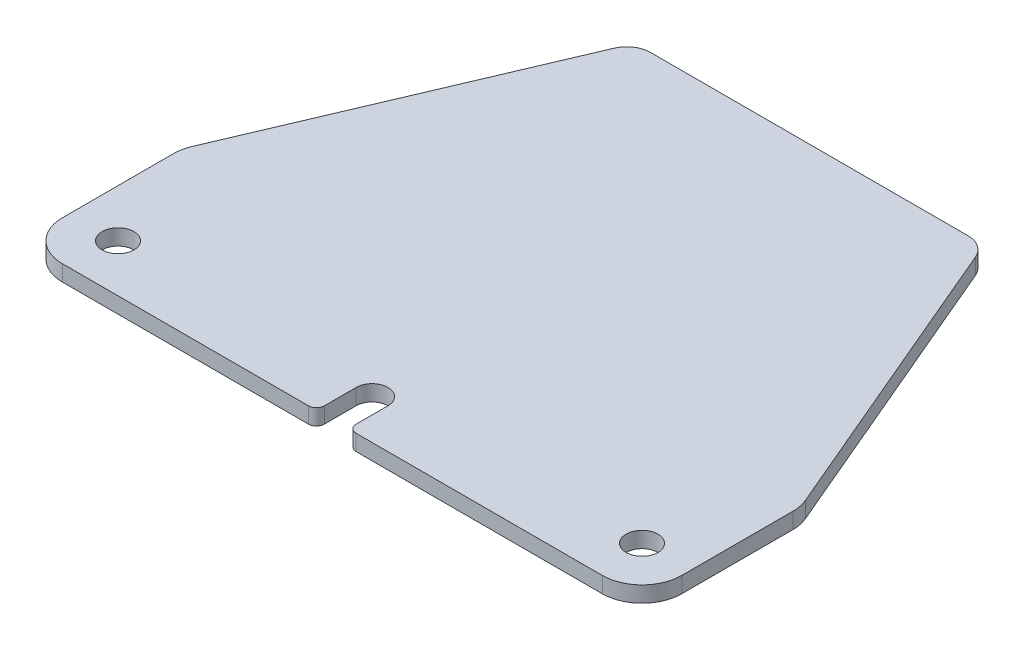
ISO-10303-21;
HEADER;
FILE_DESCRIPTION(('STEP AP214'),'2;1');
FILE_NAME('part.step','',(''),(''),'','','');
FILE_SCHEMA(('AUTOMOTIVE_DESIGN { 1 0 10303 214 1 1 1 1 }'));
ENDSEC;
DATA;
#1=APPLICATION_CONTEXT('core data for automotive mechanical design processes');
#2=APPLICATION_PROTOCOL_DEFINITION('international standard','automotive_design',2000,#1);
#3=PRODUCT_CONTEXT('',#1,'mechanical');
#4=PRODUCT('Part','Part','',(#3));
#5=PRODUCT_RELATED_PRODUCT_CATEGORY('part','',(#4));
#6=PRODUCT_DEFINITION_FORMATION('','',#4);
#7=PRODUCT_DEFINITION_CONTEXT('part definition',#1,'design');
#8=PRODUCT_DEFINITION('design','',#6,#7);
#9=PRODUCT_DEFINITION_SHAPE('','',#8);
#10=(LENGTH_UNIT() NAMED_UNIT(*) SI_UNIT(.MILLI.,.METRE.));
#11=(NAMED_UNIT(*) PLANE_ANGLE_UNIT() SI_UNIT($,.RADIAN.));
#12=(NAMED_UNIT(*) SI_UNIT($,.STERADIAN.) SOLID_ANGLE_UNIT());
#13=UNCERTAINTY_MEASURE_WITH_UNIT(LENGTH_MEASURE(1.E-05),#10,'distance_accuracy_value','');
#14=(GEOMETRIC_REPRESENTATION_CONTEXT(3) GLOBAL_UNCERTAINTY_ASSIGNED_CONTEXT((#13)) GLOBAL_UNIT_ASSIGNED_CONTEXT((#10,
#11,#12)) REPRESENTATION_CONTEXT('',''));
#15=CARTESIAN_POINT('',(0.,0.,0.));
#16=DIRECTION('',(0.,0.,1.));
#17=DIRECTION('',(1.,0.,0.));
#18=AXIS2_PLACEMENT_3D('',#15,#16,#17);
#19=CARTESIAN_POINT('',(-17.7,-2.,60.));
#20=DIRECTION('',(0.,0.,1.));
#21=DIRECTION('',(1.,0.,0.));
#22=AXIS2_PLACEMENT_3D('',#19,#20,#21);
#23=PLANE('',#22);
#24=DIRECTION('',(1.,0.,0.));
#25=VECTOR('',#24,1.);
#26=CARTESIAN_POINT('',(-17.7,0.,60.));
#27=LINE('',#26,#25);
#28=CARTESIAN_POINT('',(2.99999999999999,0.,60.));
#29=VERTEX_POINT('',#28);
#30=CARTESIAN_POINT('',(33.954644901112,0.,60.));
#31=VERTEX_POINT('',#30);
#32=EDGE_CURVE('E185',#29,#31,#27,.T.);
#33=ORIENTED_EDGE('',*,*,#32,.F.);
#34=DIRECTION('',(0.,1.,0.));
#35=VECTOR('',#34,1.);
#36=CARTESIAN_POINT('',(2.99999999999999,-2.,60.));
#37=LINE('',#36,#35);
#38=CARTESIAN_POINT('',(2.99999999999999,-2.,60.));
#39=VERTEX_POINT('',#38);
#40=EDGE_CURVE('E12',#29,#39,#37,.F.);
#41=ORIENTED_EDGE('',*,*,#40,.T.);
#42=DIRECTION('',(1.,0.,0.));
#43=VECTOR('',#42,1.);
#44=CARTESIAN_POINT('',(-17.7,-2.,60.));
#45=LINE('',#44,#43);
#46=CARTESIAN_POINT('',(33.954644901112,-1.9999999999999,60.));
#47=VERTEX_POINT('',#46);
#48=EDGE_CURVE('E345',#39,#47,#45,.T.);
#49=ORIENTED_EDGE('',*,*,#48,.T.);
#50=DIRECTION('',(0.,-1.,0.));
#51=VECTOR('',#50,1.);
#52=CARTESIAN_POINT('',(33.954644901112,0.,60.));
#53=LINE('',#52,#51);
#54=EDGE_CURVE('E293',#31,#47,#53,.T.);
#55=ORIENTED_EDGE('',*,*,#54,.F.);
#56=EDGE_LOOP('',(#33,#41,#49,#55));
#57=FACE_BOUND('',#56,.T.);
#58=ADVANCED_FACE('F47',(#57),#23,.T.);
#59=CARTESIAN_POINT('',(0.,-2.,0.));
#60=DIRECTION('',(0.,0.,-1.));
#61=DIRECTION('',(-1.,0.,0.));
#62=AXIS2_PLACEMENT_3D('',#59,#60,#61);
#63=PLANE('',#62);
#64=DIRECTION('',(-1.,0.,0.));
#65=VECTOR('',#64,1.);
#66=CARTESIAN_POINT('',(0.,-2.,0.));
#67=LINE('',#66,#65);
#68=CARTESIAN_POINT('',(19.9699478292969,-1.99999999999999,0.));
#69=VERTEX_POINT('',#68);
#70=CARTESIAN_POINT('',(-19.9699478292969,-1.99999999999999,0.));
#71=VERTEX_POINT('',#70);
#72=EDGE_CURVE('E184',#69,#71,#67,.T.);
#73=ORIENTED_EDGE('',*,*,#72,.T.);
#74=DIRECTION('',(0.,1.,0.));
#75=VECTOR('',#74,1.);
#76=CARTESIAN_POINT('',(-19.9699478292968,0.,0.));
#77=LINE('',#76,#75);
#78=CARTESIAN_POINT('',(-19.9699478292968,0.,0.));
#79=VERTEX_POINT('',#78);
#80=EDGE_CURVE('E196',#71,#79,#77,.T.);
#81=ORIENTED_EDGE('',*,*,#80,.T.);
#82=DIRECTION('',(-1.,0.,0.));
#83=VECTOR('',#82,1.);
#84=CARTESIAN_POINT('',(0.,0.,0.));
#85=LINE('',#84,#83);
#86=CARTESIAN_POINT('',(19.9699478292968,0.,0.));
#87=VERTEX_POINT('',#86);
#88=EDGE_CURVE('E342',#87,#79,#85,.T.);
#89=ORIENTED_EDGE('',*,*,#88,.F.);
#90=DIRECTION('',(0.,1.,0.));
#91=VECTOR('',#90,1.);
#92=CARTESIAN_POINT('',(19.9699478292968,0.,0.));
#93=LINE('',#92,#91);
#94=EDGE_CURVE('E308',#69,#87,#93,.T.);
#95=ORIENTED_EDGE('',*,*,#94,.F.);
#96=EDGE_LOOP('',(#73,#81,#89,#95));
#97=FACE_BOUND('',#96,.T.);
#98=ADVANCED_FACE('F400',(#97),#63,.T.);
#99=CARTESIAN_POINT('',(0.,-2.,0.));
#100=DIRECTION('',(0.,1.,0.));
#101=DIRECTION('',(0.,0.,1.));
#102=AXIS2_PLACEMENT_3D('',#99,#100,#101);
#103=PLANE('',#102);
#104=DIRECTION('',(0.,0.,-1.));
#105=VECTOR('',#104,1.);
#106=CARTESIAN_POINT('',(-1.99999999999999,-2.,55.));
#107=LINE('',#106,#105);
#108=CARTESIAN_POINT('',(-1.99999999999999,-2.,59.));
#109=VERTEX_POINT('',#108);
#110=CARTESIAN_POINT('',(-1.99999999999999,-2.,55.));
#111=VERTEX_POINT('',#110);
#112=EDGE_CURVE('E323',#109,#111,#107,.T.);
#113=ORIENTED_EDGE('',*,*,#112,.F.);
#114=CARTESIAN_POINT('',(-2.99999999999999,-2.,59.));
#115=DIRECTION('',(0.,1.,0.));
#116=DIRECTION('',(0.,0.,1.));
#117=AXIS2_PLACEMENT_3D('',#114,#115,#116);
#118=CIRCLE('',#117,1.);
#119=CARTESIAN_POINT('',(-2.99999999999999,-2.,60.));
#120=VERTEX_POINT('',#119);
#121=EDGE_CURVE('E364',#109,#120,#118,.F.);
#122=ORIENTED_EDGE('',*,*,#121,.T.);
#123=CARTESIAN_POINT('',(-33.954644901112,-1.9999999999999,60.));
#124=VERTEX_POINT('',#123);
#125=EDGE_CURVE('E346',#124,#120,#45,.T.);
#126=ORIENTED_EDGE('',*,*,#125,.F.);
#127=CARTESIAN_POINT('',(-33.954644901112,-1.9999999999999,55.));
#128=DIRECTION('',(0.,-1.,0.));
#129=DIRECTION('',(1.,0.,0.));
#130=AXIS2_PLACEMENT_3D('',#127,#128,#129);
#131=CIRCLE('',#130,5.);
#132=CARTESIAN_POINT('',(-38.954644901112,-1.99999999999987,55.));
#133=VERTEX_POINT('',#132);
#134=EDGE_CURVE('E200',#124,#133,#131,.T.);
#135=ORIENTED_EDGE('',*,*,#134,.T.);
#136=DIRECTION('',(0.,0.,1.));
#137=VECTOR('',#136,1.);
#138=CARTESIAN_POINT('',(-38.954644901112,-1.99999999999987,60.));
#139=LINE('',#138,#137);
#140=CARTESIAN_POINT('',(-38.954644901112,-1.99999999999987,41.018419889471));
#141=VERTEX_POINT('',#140);
#142=EDGE_CURVE('E240',#141,#133,#139,.T.);
#143=ORIENTED_EDGE('',*,*,#142,.F.);
#144=CARTESIAN_POINT('',(-33.954644901112,-1.9999999999999,41.018419889471));
#145=DIRECTION('',(0.,-1.,0.));
#146=DIRECTION('',(1.,0.,0.));
#147=AXIS2_PLACEMENT_3D('',#144,#145,#146);
#148=CIRCLE('',#147,5.);
#149=CARTESIAN_POINT('',(-38.5562994934044,-1.99999999999986,39.0627166877468));
#150=VERTEX_POINT('',#149);
#151=EDGE_CURVE('E203',#141,#150,#148,.T.);
#152=ORIENTED_EDGE('',*,*,#151,.T.);
#153=DIRECTION('',(-0.391140640344853,0.,0.920330918458474));
#154=VECTOR('',#153,1.);
#155=CARTESIAN_POINT('',(-21.954644901112,-1.99999999999997,0.));
#156=LINE('',#155,#154);
#157=CARTESIAN_POINT('',(-22.7309405846723,-1.99999999999997,1.82657807896545));
#158=VERTEX_POINT('',#157);
#159=EDGE_CURVE('E231',#158,#150,#156,.T.);
#160=ORIENTED_EDGE('',*,*,#159,.F.);
#161=CARTESIAN_POINT('',(-19.9699478292969,-1.99999999999999,3.));
#162=DIRECTION('',(0.,-1.,0.));
#163=DIRECTION('',(1.,0.,0.));
#164=AXIS2_PLACEMENT_3D('',#161,#162,#163);
#165=CIRCLE('',#164,3.);
#166=EDGE_CURVE('E215',#158,#71,#165,.T.);
#167=ORIENTED_EDGE('',*,*,#166,.T.);
#168=ORIENTED_EDGE('',*,*,#72,.F.);
#169=CARTESIAN_POINT('',(19.9699478292969,-1.99999999999999,3.));
#170=DIRECTION('',(0.,1.,0.));
#171=DIRECTION('',(-1.,0.,0.));
#172=AXIS2_PLACEMENT_3D('',#169,#170,#171);
#173=CIRCLE('',#172,3.);
#174=CARTESIAN_POINT('',(22.7309405846723,-1.99999999999997,1.82657807896545));
#175=VERTEX_POINT('',#174);
#176=EDGE_CURVE('E312',#175,#69,#173,.T.);
#177=ORIENTED_EDGE('',*,*,#176,.F.);
#178=DIRECTION('',(0.391140640344853,0.,0.920330918458474));
#179=VECTOR('',#178,1.);
#180=CARTESIAN_POINT('',(21.954644901112,-1.99999999999997,0.));
#181=LINE('',#180,#179);
#182=CARTESIAN_POINT('',(38.5562994934044,-1.99999999999986,39.0627166877468));
#183=VERTEX_POINT('',#182);
#184=EDGE_CURVE('E256',#175,#183,#181,.T.);
#185=ORIENTED_EDGE('',*,*,#184,.T.);
#186=CARTESIAN_POINT('',(33.954644901112,-1.9999999999999,41.018419889471));
#187=DIRECTION('',(0.,1.,0.));
#188=DIRECTION('',(-1.,0.,0.));
#189=AXIS2_PLACEMENT_3D('',#186,#187,#188);
#190=CIRCLE('',#189,5.);
#191=CARTESIAN_POINT('',(38.954644901112,-1.99999999999987,41.018419889471));
#192=VERTEX_POINT('',#191);
#193=EDGE_CURVE('E278',#192,#183,#190,.T.);
#194=ORIENTED_EDGE('',*,*,#193,.F.);
#195=DIRECTION('',(0.,0.,1.));
#196=VECTOR('',#195,1.);
#197=CARTESIAN_POINT('',(38.954644901112,-1.99999999999987,60.));
#198=LINE('',#197,#196);
#199=CARTESIAN_POINT('',(38.954644901112,-1.99999999999987,55.));
#200=VERTEX_POINT('',#199);
#201=EDGE_CURVE('E252',#192,#200,#198,.T.);
#202=ORIENTED_EDGE('',*,*,#201,.T.);
#203=CARTESIAN_POINT('',(33.954644901112,-1.9999999999999,55.));
#204=DIRECTION('',(0.,1.,0.));
#205=DIRECTION('',(-1.,0.,0.));
#206=AXIS2_PLACEMENT_3D('',#203,#204,#205);
#207=CIRCLE('',#206,5.);
#208=EDGE_CURVE('E289',#47,#200,#207,.T.);
#209=ORIENTED_EDGE('',*,*,#208,.F.);
#210=ORIENTED_EDGE('',*,*,#48,.F.);
#211=CARTESIAN_POINT('',(2.99999999999999,-2.,59.));
#212=DIRECTION('',(0.,1.,0.));
#213=DIRECTION('',(0.,0.,1.));
#214=AXIS2_PLACEMENT_3D('',#211,#212,#213);
#215=CIRCLE('',#214,1.);
#216=CARTESIAN_POINT('',(1.99999999999999,-2.,59.));
#217=VERTEX_POINT('',#216);
#218=EDGE_CURVE('E63',#39,#217,#215,.F.);
#219=ORIENTED_EDGE('',*,*,#218,.T.);
#220=DIRECTION('',(0.,0.,1.));
#221=VECTOR('',#220,1.);
#222=CARTESIAN_POINT('',(1.99999999999999,-2.,55.));
#223=LINE('',#222,#221);
#224=CARTESIAN_POINT('',(1.99999999999999,-2.,55.));
#225=VERTEX_POINT('',#224);
#226=EDGE_CURVE('E316',#225,#217,#223,.T.);
#227=ORIENTED_EDGE('',*,*,#226,.F.);
#228=CARTESIAN_POINT('',(0.,-2.,55.));
#229=DIRECTION('',(0.,1.,0.));
#230=DIRECTION('',(0.,0.,1.));
#231=AXIS2_PLACEMENT_3D('',#228,#229,#230);
#232=CIRCLE('',#231,1.99999999999999);
#233=EDGE_CURVE('E319',#111,#225,#232,.F.);
#234=ORIENTED_EDGE('',*,*,#233,.F.);
#235=EDGE_LOOP('',(#113,#122,#126,#135,#143,#152,#160,#167,#168,#177,#185,#194,#202,#209,#210,
#219,#227,#234));
#236=FACE_BOUND('',#235,.T.);
#237=CARTESIAN_POINT('',(32.954644901112,-1.99999999999991,54.));
#238=DIRECTION('',(0.,1.,0.));
#239=DIRECTION('',(-1.,0.,0.));
#240=AXIS2_PLACEMENT_3D('',#237,#238,#239);
#241=CIRCLE('',#240,2.);
#242=CARTESIAN_POINT('',(30.954644901112,-1.99999999999993,54.));
#243=VERTEX_POINT('',#242);
#244=EDGE_CURVE('E260',#243,#243,#241,.F.);
#245=ORIENTED_EDGE('',*,*,#244,.F.);
#246=EDGE_LOOP('',(#245));
#247=FACE_BOUND('',#246,.T.);
#248=CARTESIAN_POINT('',(-32.954644901112,-1.99999999999991,54.));
#249=DIRECTION('',(0.,-1.,0.));
#250=DIRECTION('',(1.,0.,0.));
#251=AXIS2_PLACEMENT_3D('',#248,#249,#250);
#252=CIRCLE('',#251,2.);
#253=CARTESIAN_POINT('',(-30.954644901112,-1.99999999999993,54.));
#254=VERTEX_POINT('',#253);
#255=EDGE_CURVE('E219',#254,#254,#252,.F.);
#256=ORIENTED_EDGE('',*,*,#255,.T.);
#257=EDGE_LOOP('',(#256));
#258=FACE_BOUND('',#257,.T.);
#259=ADVANCED_FACE('F381',(#236,#247,#258),#103,.F.);
#260=CARTESIAN_POINT('',(0.,0.,0.));
#261=DIRECTION('',(0.,1.,0.));
#262=DIRECTION('',(0.,0.,1.));
#263=AXIS2_PLACEMENT_3D('',#260,#261,#262);
#264=PLANE('',#263);
#265=CARTESIAN_POINT('',(-33.954644901112,0.,60.));
#266=VERTEX_POINT('',#265);
#267=CARTESIAN_POINT('',(-2.99999999999999,0.,60.));
#268=VERTEX_POINT('',#267);
#269=EDGE_CURVE('E174',#266,#268,#27,.T.);
#270=ORIENTED_EDGE('',*,*,#269,.T.);
#271=CARTESIAN_POINT('',(-2.99999999999999,0.,59.));
#272=DIRECTION('',(0.,1.,0.));
#273=DIRECTION('',(0.,0.,1.));
#274=AXIS2_PLACEMENT_3D('',#271,#272,#273);
#275=CIRCLE('',#274,1.);
#276=CARTESIAN_POINT('',(-1.99999999999999,0.,59.));
#277=VERTEX_POINT('',#276);
#278=EDGE_CURVE('E356',#268,#277,#275,.T.);
#279=ORIENTED_EDGE('',*,*,#278,.T.);
#280=DIRECTION('',(0.,0.,1.));
#281=VECTOR('',#280,1.);
#282=CARTESIAN_POINT('',(-1.99999999999999,0.,55.));
#283=LINE('',#282,#281);
#284=CARTESIAN_POINT('',(-1.99999999999999,0.,55.));
#285=VERTEX_POINT('',#284);
#286=EDGE_CURVE('E327',#285,#277,#283,.T.);
#287=ORIENTED_EDGE('',*,*,#286,.F.);
#288=CARTESIAN_POINT('',(0.,0.,55.));
#289=DIRECTION('',(0.,1.,0.));
#290=DIRECTION('',(0.,0.,1.));
#291=AXIS2_PLACEMENT_3D('',#288,#289,#290);
#292=CIRCLE('',#291,1.99999999999999);
#293=CARTESIAN_POINT('',(1.99999999999999,0.,55.));
#294=VERTEX_POINT('',#293);
#295=EDGE_CURVE('E251',#294,#285,#292,.T.);
#296=ORIENTED_EDGE('',*,*,#295,.F.);
#297=DIRECTION('',(0.,0.,-1.));
#298=VECTOR('',#297,1.);
#299=CARTESIAN_POINT('',(1.99999999999999,0.,55.));
#300=LINE('',#299,#298);
#301=CARTESIAN_POINT('',(1.99999999999999,0.,59.));
#302=VERTEX_POINT('',#301);
#303=EDGE_CURVE('E331',#302,#294,#300,.T.);
#304=ORIENTED_EDGE('',*,*,#303,.F.);
#305=CARTESIAN_POINT('',(2.99999999999999,0.,59.));
#306=DIRECTION('',(0.,1.,0.));
#307=DIRECTION('',(0.,0.,1.));
#308=AXIS2_PLACEMENT_3D('',#305,#306,#307);
#309=CIRCLE('',#308,1.);
#310=EDGE_CURVE('E353',#302,#29,#309,.T.);
#311=ORIENTED_EDGE('',*,*,#310,.T.);
#312=ORIENTED_EDGE('',*,*,#32,.T.);
#313=CARTESIAN_POINT('',(33.954644901112,0.,55.));
#314=DIRECTION('',(0.,1.,0.));
#315=DIRECTION('',(-1.,0.,0.));
#316=AXIS2_PLACEMENT_3D('',#313,#314,#315);
#317=CIRCLE('',#316,5.);
#318=CARTESIAN_POINT('',(38.954644901112,1.31838984174237E-13,55.));
#319=VERTEX_POINT('',#318);
#320=EDGE_CURVE('E297',#319,#31,#317,.F.);
#321=ORIENTED_EDGE('',*,*,#320,.F.);
#322=DIRECTION('',(0.,0.,1.));
#323=VECTOR('',#322,1.);
#324=CARTESIAN_POINT('',(38.954644901112,1.31838984174237E-13,60.));
#325=LINE('',#324,#323);
#326=CARTESIAN_POINT('',(38.954644901112,1.35308431126191E-13,41.018419889471));
#327=VERTEX_POINT('',#326);
#328=EDGE_CURVE('E282',#327,#319,#325,.T.);
#329=ORIENTED_EDGE('',*,*,#328,.F.);
#330=CARTESIAN_POINT('',(33.954644901112,1.00613961606655E-13,41.018419889471));
#331=DIRECTION('',(0.,1.,0.));
#332=DIRECTION('',(-1.,0.,0.));
#333=AXIS2_PLACEMENT_3D('',#330,#331,#332);
#334=CIRCLE('',#333,5.);
#335=CARTESIAN_POINT('',(38.5562994934044,1.35308431126191E-13,39.0627166877468));
#336=VERTEX_POINT('',#335);
#337=EDGE_CURVE('E271',#336,#327,#334,.F.);
#338=ORIENTED_EDGE('',*,*,#337,.F.);
#339=DIRECTION('',(0.391140640344853,0.,0.920330918458474));
#340=VECTOR('',#339,1.);
#341=CARTESIAN_POINT('',(21.9546449011119,0.,0.));
#342=LINE('',#341,#340);
#343=CARTESIAN_POINT('',(22.7309405846723,0.,1.82657807896545));
#344=VERTEX_POINT('',#343);
#345=EDGE_CURVE('E264',#344,#336,#342,.T.);
#346=ORIENTED_EDGE('',*,*,#345,.F.);
#347=CARTESIAN_POINT('',(19.9699478292968,0.,3.));
#348=DIRECTION('',(0.,1.,0.));
#349=DIRECTION('',(-1.,0.,0.));
#350=AXIS2_PLACEMENT_3D('',#347,#348,#349);
#351=CIRCLE('',#350,3.);
#352=EDGE_CURVE('E304',#87,#344,#351,.F.);
#353=ORIENTED_EDGE('',*,*,#352,.F.);
#354=ORIENTED_EDGE('',*,*,#88,.T.);
#355=CARTESIAN_POINT('',(-19.9699478292968,0.,3.));
#356=DIRECTION('',(0.,-1.,0.));
#357=DIRECTION('',(1.,0.,0.));
#358=AXIS2_PLACEMENT_3D('',#355,#356,#357);
#359=CIRCLE('',#358,3.);
#360=CARTESIAN_POINT('',(-22.7309405846723,0.,1.82657807896545));
#361=VERTEX_POINT('',#360);
#362=EDGE_CURVE('E202',#79,#361,#359,.F.);
#363=ORIENTED_EDGE('',*,*,#362,.T.);
#364=DIRECTION('',(-0.391140640344853,0.,0.920330918458474));
#365=VECTOR('',#364,1.);
#366=CARTESIAN_POINT('',(-21.9546449011119,0.,0.));
#367=LINE('',#366,#365);
#368=CARTESIAN_POINT('',(-38.5562994934044,1.35308431126191E-13,39.0627166877468));
#369=VERTEX_POINT('',#368);
#370=EDGE_CURVE('E207',#361,#369,#367,.T.);
#371=ORIENTED_EDGE('',*,*,#370,.T.);
#372=CARTESIAN_POINT('',(-33.954644901112,1.00613961606655E-13,41.018419889471));
#373=DIRECTION('',(0.,-1.,0.));
#374=DIRECTION('',(1.,0.,0.));
#375=AXIS2_PLACEMENT_3D('',#372,#373,#374);
#376=CIRCLE('',#375,5.);
#377=CARTESIAN_POINT('',(-38.954644901112,1.35308431126191E-13,41.018419889471));
#378=VERTEX_POINT('',#377);
#379=EDGE_CURVE('E636',#369,#378,#376,.F.);
#380=ORIENTED_EDGE('',*,*,#379,.T.);
#381=DIRECTION('',(0.,0.,1.));
#382=VECTOR('',#381,1.);
#383=CARTESIAN_POINT('',(-38.954644901112,1.31838984174237E-13,60.));
#384=LINE('',#383,#382);
#385=CARTESIAN_POINT('',(-38.954644901112,1.31838984174237E-13,55.));
#386=VERTEX_POINT('',#385);
#387=EDGE_CURVE('E192',#378,#386,#384,.T.);
#388=ORIENTED_EDGE('',*,*,#387,.T.);
#389=CARTESIAN_POINT('',(-33.954644901112,0.,55.));
#390=DIRECTION('',(0.,-1.,0.));
#391=DIRECTION('',(1.,0.,0.));
#392=AXIS2_PLACEMENT_3D('',#389,#390,#391);
#393=CIRCLE('',#392,5.);
#394=EDGE_CURVE('E189',#386,#266,#393,.F.);
#395=ORIENTED_EDGE('',*,*,#394,.T.);
#396=EDGE_LOOP('',(#270,#279,#287,#296,#304,#311,#312,#321,#329,#338,#346,#353,#354,#363,#371,
#380,#388,#395));
#397=FACE_BOUND('',#396,.T.);
#398=CARTESIAN_POINT('',(32.954644901112,0.,54.));
#399=DIRECTION('',(0.,-1.,0.));
#400=DIRECTION('',(1.,0.,0.));
#401=AXIS2_PLACEMENT_3D('',#398,#399,#400);
#402=CIRCLE('',#401,2.);
#403=CARTESIAN_POINT('',(34.954644901112,1.04127477332387E-13,54.));
#404=VERTEX_POINT('',#403);
#405=EDGE_CURVE('E247',#404,#404,#402,.T.);
#406=ORIENTED_EDGE('',*,*,#405,.T.);
#407=EDGE_LOOP('',(#406));
#408=FACE_BOUND('',#407,.T.);
#409=CARTESIAN_POINT('',(-32.954644901112,0.,54.));
#410=DIRECTION('',(0.,1.,0.));
#411=DIRECTION('',(-1.,0.,0.));
#412=AXIS2_PLACEMENT_3D('',#409,#410,#411);
#413=CIRCLE('',#412,2.);
#414=CARTESIAN_POINT('',(-34.954644901112,1.04127477332387E-13,54.));
#415=VERTEX_POINT('',#414);
#416=EDGE_CURVE('E223',#415,#415,#413,.T.);
#417=ORIENTED_EDGE('',*,*,#416,.F.);
#418=EDGE_LOOP('',(#417));
#419=FACE_BOUND('',#418,.T.);
#420=ADVANCED_FACE('F49',(#397,#408,#419),#264,.T.);
#421=ORIENTED_EDGE('',*,*,#125,.T.);
#422=DIRECTION('',(0.,1.,0.));
#423=VECTOR('',#422,1.);
#424=CARTESIAN_POINT('',(-2.99999999999999,0.,60.));
#425=LINE('',#424,#423);
#426=EDGE_CURVE('E181',#120,#268,#425,.T.);
#427=ORIENTED_EDGE('',*,*,#426,.T.);
#428=ORIENTED_EDGE('',*,*,#269,.F.);
#429=DIRECTION('',(0.,-1.,0.));
#430=VECTOR('',#429,1.);
#431=CARTESIAN_POINT('',(-33.954644901112,0.,60.));
#432=LINE('',#431,#430);
#433=EDGE_CURVE('E179',#266,#124,#432,.T.);
#434=ORIENTED_EDGE('',*,*,#433,.T.);
#435=EDGE_LOOP('',(#421,#427,#428,#434));
#436=FACE_BOUND('',#435,.T.);
#437=ADVANCED_FACE('F177',(#436),#23,.T.);
#438=CARTESIAN_POINT('',(0.,-10.0622577482985,55.));
#439=DIRECTION('',(0.,1.,0.));
#440=DIRECTION('',(0.,0.,1.));
#441=AXIS2_PLACEMENT_3D('',#438,#439,#440);
#442=CYLINDRICAL_SURFACE('',#441,1.99999999999999);
#443=ORIENTED_EDGE('',*,*,#233,.T.);
#444=DIRECTION('',(0.,1.,0.));
#445=VECTOR('',#444,1.);
#446=CARTESIAN_POINT('',(1.99999999999999,-10.0622577482985,55.));
#447=LINE('',#446,#445);
#448=EDGE_CURVE('E320',#225,#294,#447,.T.);
#449=ORIENTED_EDGE('',*,*,#448,.T.);
#450=ORIENTED_EDGE('',*,*,#295,.T.);
#451=DIRECTION('',(0.,1.,0.));
#452=VECTOR('',#451,1.);
#453=CARTESIAN_POINT('',(-1.99999999999999,-10.0622577482985,55.));
#454=LINE('',#453,#452);
#455=EDGE_CURVE('E334',#111,#285,#454,.T.);
#456=ORIENTED_EDGE('',*,*,#455,.F.);
#457=EDGE_LOOP('',(#443,#449,#450,#456));
#458=FACE_BOUND('',#457,.T.);
#459=ADVANCED_FACE('F378',(#458),#442,.F.);
#460=CARTESIAN_POINT('',(1.99999999999999,-10.0622577482985,55.));
#461=DIRECTION('',(1.,0.,0.));
#462=DIRECTION('',(0.,0.,-1.));
#463=AXIS2_PLACEMENT_3D('',#460,#461,#462);
#464=PLANE('',#463);
#465=ORIENTED_EDGE('',*,*,#226,.T.);
#466=DIRECTION('',(0.,1.,0.));
#467=VECTOR('',#466,1.);
#468=CARTESIAN_POINT('',(1.99999999999999,0.,59.));
#469=LINE('',#468,#467);
#470=EDGE_CURVE('E56',#217,#302,#469,.T.);
#471=ORIENTED_EDGE('',*,*,#470,.T.);
#472=ORIENTED_EDGE('',*,*,#303,.T.);
#473=ORIENTED_EDGE('',*,*,#448,.F.);
#474=EDGE_LOOP('',(#465,#471,#472,#473));
#475=FACE_BOUND('',#474,.T.);
#476=ADVANCED_FACE('F371',(#475),#464,.F.);
#477=CARTESIAN_POINT('',(-1.99999999999999,-10.0622577482985,55.));
#478=DIRECTION('',(-1.,0.,0.));
#479=DIRECTION('',(0.,0.,1.));
#480=AXIS2_PLACEMENT_3D('',#477,#478,#479);
#481=PLANE('',#480);
#482=ORIENTED_EDGE('',*,*,#286,.T.);
#483=DIRECTION('',(0.,1.,0.));
#484=VECTOR('',#483,1.);
#485=CARTESIAN_POINT('',(-1.99999999999999,-2.,59.));
#486=LINE('',#485,#484);
#487=EDGE_CURVE('E359',#277,#109,#486,.F.);
#488=ORIENTED_EDGE('',*,*,#487,.T.);
#489=ORIENTED_EDGE('',*,*,#112,.T.);
#490=ORIENTED_EDGE('',*,*,#455,.T.);
#491=EDGE_LOOP('',(#482,#488,#489,#490));
#492=FACE_BOUND('',#491,.T.);
#493=ADVANCED_FACE('F388',(#492),#481,.F.);
#494=CARTESIAN_POINT('',(-2.99999999999999,-2.,59.));
#495=DIRECTION('',(0.,-1.,0.));
#496=DIRECTION('',(0.,0.,-1.));
#497=AXIS2_PLACEMENT_3D('',#494,#495,#496);
#498=CYLINDRICAL_SURFACE('',#497,1.);
#499=ORIENTED_EDGE('',*,*,#121,.F.);
#500=ORIENTED_EDGE('',*,*,#487,.F.);
#501=ORIENTED_EDGE('',*,*,#278,.F.);
#502=ORIENTED_EDGE('',*,*,#426,.F.);
#503=EDGE_LOOP('',(#499,#500,#501,#502));
#504=FACE_BOUND('',#503,.T.);
#505=ADVANCED_FACE('F387',(#504),#498,.T.);
#506=CARTESIAN_POINT('',(2.99999999999999,-10.0622577482985,59.));
#507=DIRECTION('',(0.,-1.,0.));
#508=DIRECTION('',(0.,0.,-1.));
#509=AXIS2_PLACEMENT_3D('',#506,#507,#508);
#510=CYLINDRICAL_SURFACE('',#509,1.);
#511=ORIENTED_EDGE('',*,*,#218,.F.);
#512=ORIENTED_EDGE('',*,*,#40,.F.);
#513=ORIENTED_EDGE('',*,*,#310,.F.);
#514=ORIENTED_EDGE('',*,*,#470,.F.);
#515=EDGE_LOOP('',(#511,#512,#513,#514));
#516=FACE_BOUND('',#515,.T.);
#517=ADVANCED_FACE('F395',(#516),#510,.T.);
#518=CARTESIAN_POINT('',(19.9699478292968,0.,3.));
#519=DIRECTION('',(0.,-1.,0.));
#520=DIRECTION('',(-1.,0.,0.));
#521=AXIS2_PLACEMENT_3D('',#518,#519,#520);
#522=CYLINDRICAL_SURFACE('',#521,3.);
#523=ORIENTED_EDGE('',*,*,#176,.T.);
#524=ORIENTED_EDGE('',*,*,#94,.T.);
#525=ORIENTED_EDGE('',*,*,#352,.T.);
#526=DIRECTION('',(0.,1.,0.));
#527=VECTOR('',#526,1.);
#528=CARTESIAN_POINT('',(22.7309405846723,-1.99999999999994,1.82657807896544));
#529=LINE('',#528,#527);
#530=EDGE_CURVE('E301',#344,#175,#529,.F.);
#531=ORIENTED_EDGE('',*,*,#530,.T.);
#532=EDGE_LOOP('',(#523,#524,#525,#531));
#533=FACE_BOUND('',#532,.T.);
#534=ADVANCED_FACE('F607',(#533),#522,.T.);
#535=CARTESIAN_POINT('',(33.954644901112,0.,55.));
#536=DIRECTION('',(0.,-1.,0.));
#537=DIRECTION('',(-1.,0.,0.));
#538=AXIS2_PLACEMENT_3D('',#535,#536,#537);
#539=CYLINDRICAL_SURFACE('',#538,5.);
#540=ORIENTED_EDGE('',*,*,#320,.T.);
#541=ORIENTED_EDGE('',*,*,#54,.T.);
#542=ORIENTED_EDGE('',*,*,#208,.T.);
#543=DIRECTION('',(0.,-1.,0.));
#544=VECTOR('',#543,1.);
#545=CARTESIAN_POINT('',(38.954644901112,1.31838984174237E-13,55.));
#546=LINE('',#545,#544);
#547=EDGE_CURVE('E286',#200,#319,#546,.F.);
#548=ORIENTED_EDGE('',*,*,#547,.T.);
#549=EDGE_LOOP('',(#540,#541,#542,#548));
#550=FACE_BOUND('',#549,.T.);
#551=ADVANCED_FACE('F542',(#550),#539,.T.);
#552=CARTESIAN_POINT('',(38.954644901112,1.31838984174237E-13,60.));
#553=DIRECTION('',(-1.,0.,0.));
#554=DIRECTION('',(0.,1.,0.));
#555=AXIS2_PLACEMENT_3D('',#552,#553,#554);
#556=PLANE('',#555);
#557=ORIENTED_EDGE('',*,*,#328,.T.);
#558=ORIENTED_EDGE('',*,*,#547,.F.);
#559=ORIENTED_EDGE('',*,*,#201,.F.);
#560=DIRECTION('',(0.,1.,0.));
#561=VECTOR('',#560,1.);
#562=CARTESIAN_POINT('',(38.954644901112,-1.99999999999989,41.018419889471));
#563=LINE('',#562,#561);
#564=EDGE_CURVE('E268',#327,#192,#563,.F.);
#565=ORIENTED_EDGE('',*,*,#564,.F.);
#566=EDGE_LOOP('',(#557,#558,#559,#565));
#567=FACE_BOUND('',#566,.T.);
#568=ADVANCED_FACE('F536',(#567),#556,.F.);
#569=CARTESIAN_POINT('',(33.9546449011123,-45.4626276242014,41.018419889471));
#570=DIRECTION('',(0.,-1.,0.));
#571=DIRECTION('',(-1.,0.,0.));
#572=AXIS2_PLACEMENT_3D('',#569,#570,#571);
#573=CYLINDRICAL_SURFACE('',#572,5.);
#574=ORIENTED_EDGE('',*,*,#193,.T.);
#575=DIRECTION('',(0.,1.,0.));
#576=VECTOR('',#575,1.);
#577=CARTESIAN_POINT('',(38.5562994934044,1.14491749414469E-13,39.0627166877467));
#578=LINE('',#577,#576);
#579=EDGE_CURVE('E275',#183,#336,#578,.T.);
#580=ORIENTED_EDGE('',*,*,#579,.T.);
#581=ORIENTED_EDGE('',*,*,#337,.T.);
#582=ORIENTED_EDGE('',*,*,#564,.T.);
#583=EDGE_LOOP('',(#574,#580,#581,#582));
#584=FACE_BOUND('',#583,.T.);
#585=ADVANCED_FACE('F541',(#584),#573,.T.);
#586=CARTESIAN_POINT('',(21.9546449011123,-45.4626276242015,0.));
#587=DIRECTION('',(0.920330918458474,0.,-0.391140640344853));
#588=DIRECTION('',(-0.391140640344853,0.,-0.920330918458474));
#589=AXIS2_PLACEMENT_3D('',#586,#587,#588);
#590=PLANE('',#589);
#591=ORIENTED_EDGE('',*,*,#345,.T.);
#592=ORIENTED_EDGE('',*,*,#579,.F.);
#593=ORIENTED_EDGE('',*,*,#184,.F.);
#594=ORIENTED_EDGE('',*,*,#530,.F.);
#595=EDGE_LOOP('',(#591,#592,#593,#594));
#596=FACE_BOUND('',#595,.T.);
#597=ADVANCED_FACE('F550',(#596),#590,.T.);
#598=CARTESIAN_POINT('',(32.9546449011121,-7.6568542494923,54.));
#599=DIRECTION('',(0.,1.,0.));
#600=DIRECTION('',(1.,0.,0.));
#601=AXIS2_PLACEMENT_3D('',#598,#599,#600);
#602=CYLINDRICAL_SURFACE('',#601,2.);
#603=ORIENTED_EDGE('',*,*,#405,.F.);
#604=EDGE_LOOP('',(#603));
#605=FACE_BOUND('',#604,.T.);
#606=ORIENTED_EDGE('',*,*,#244,.T.);
#607=EDGE_LOOP('',(#606));
#608=FACE_BOUND('',#607,.T.);
#609=ADVANCED_FACE('F555',(#605,#608),#602,.F.);
#610=CARTESIAN_POINT('',(-33.9546449011123,-45.4626276242014,41.018419889471));
#611=DIRECTION('',(0.,-1.,0.));
#612=DIRECTION('',(1.,0.,0.));
#613=AXIS2_PLACEMENT_3D('',#610,#611,#612);
#614=CYLINDRICAL_SURFACE('',#613,5.);
#615=ORIENTED_EDGE('',*,*,#151,.F.);
#616=DIRECTION('',(0.,1.,0.));
#617=VECTOR('',#616,1.);
#618=CARTESIAN_POINT('',(-38.954644901112,-1.99999999999989,41.018419889471));
#619=LINE('',#618,#617);
#620=EDGE_CURVE('E244',#378,#141,#619,.F.);
#621=ORIENTED_EDGE('',*,*,#620,.F.);
#622=ORIENTED_EDGE('',*,*,#379,.F.);
#623=DIRECTION('',(0.,1.,0.));
#624=VECTOR('',#623,1.);
#625=CARTESIAN_POINT('',(-38.5562994934044,1.14491749414469E-13,39.0627166877467));
#626=LINE('',#625,#624);
#627=EDGE_CURVE('E227',#150,#369,#626,.T.);
#628=ORIENTED_EDGE('',*,*,#627,.F.);
#629=EDGE_LOOP('',(#615,#621,#622,#628));
#630=FACE_BOUND('',#629,.T.);
#631=ADVANCED_FACE('F565',(#630),#614,.T.);
#632=CARTESIAN_POINT('',(-38.954644901112,1.31838984174237E-13,60.));
#633=DIRECTION('',(1.,0.,0.));
#634=DIRECTION('',(0.,1.,0.));
#635=AXIS2_PLACEMENT_3D('',#632,#633,#634);
#636=PLANE('',#635);
#637=ORIENTED_EDGE('',*,*,#387,.F.);
#638=ORIENTED_EDGE('',*,*,#620,.T.);
#639=ORIENTED_EDGE('',*,*,#142,.T.);
#640=DIRECTION('',(0.,-1.,0.));
#641=VECTOR('',#640,1.);
#642=CARTESIAN_POINT('',(-38.954644901112,1.31838984174237E-13,55.));
#643=LINE('',#642,#641);
#644=EDGE_CURVE('E237',#133,#386,#643,.F.);
#645=ORIENTED_EDGE('',*,*,#644,.T.);
#646=EDGE_LOOP('',(#637,#638,#639,#645));
#647=FACE_BOUND('',#646,.T.);
#648=ADVANCED_FACE('F572',(#647),#636,.F.);
#649=CARTESIAN_POINT('',(-33.954644901112,0.,55.));
#650=DIRECTION('',(0.,-1.,0.));
#651=DIRECTION('',(1.,0.,0.));
#652=AXIS2_PLACEMENT_3D('',#649,#650,#651);
#653=CYLINDRICAL_SURFACE('',#652,5.);
#654=ORIENTED_EDGE('',*,*,#394,.F.);
#655=ORIENTED_EDGE('',*,*,#644,.F.);
#656=ORIENTED_EDGE('',*,*,#134,.F.);
#657=ORIENTED_EDGE('',*,*,#433,.F.);
#658=EDGE_LOOP('',(#654,#655,#656,#657));
#659=FACE_BOUND('',#658,.T.);
#660=ADVANCED_FACE('F199',(#659),#653,.T.);
#661=CARTESIAN_POINT('',(-19.9699478292968,0.,3.));
#662=DIRECTION('',(0.,-1.,0.));
#663=DIRECTION('',(1.,0.,0.));
#664=AXIS2_PLACEMENT_3D('',#661,#662,#663);
#665=CYLINDRICAL_SURFACE('',#664,3.);
#666=ORIENTED_EDGE('',*,*,#166,.F.);
#667=DIRECTION('',(0.,1.,0.));
#668=VECTOR('',#667,1.);
#669=CARTESIAN_POINT('',(-22.7309405846723,-1.99999999999994,1.82657807896544));
#670=LINE('',#669,#668);
#671=EDGE_CURVE('E234',#361,#158,#670,.F.);
#672=ORIENTED_EDGE('',*,*,#671,.F.);
#673=ORIENTED_EDGE('',*,*,#362,.F.);
#674=ORIENTED_EDGE('',*,*,#80,.F.);
#675=EDGE_LOOP('',(#666,#672,#673,#674));
#676=FACE_BOUND('',#675,.T.);
#677=ADVANCED_FACE('F587',(#676),#665,.T.);
#678=CARTESIAN_POINT('',(-21.9546449011123,-45.4626276242015,0.));
#679=DIRECTION('',(-0.920330918458474,0.,-0.391140640344853));
#680=DIRECTION('',(0.391140640344853,0.,-0.920330918458474));
#681=AXIS2_PLACEMENT_3D('',#678,#679,#680);
#682=PLANE('',#681);
#683=ORIENTED_EDGE('',*,*,#370,.F.);
#684=ORIENTED_EDGE('',*,*,#671,.T.);
#685=ORIENTED_EDGE('',*,*,#159,.T.);
#686=ORIENTED_EDGE('',*,*,#627,.T.);
#687=EDGE_LOOP('',(#683,#684,#685,#686));
#688=FACE_BOUND('',#687,.T.);
#689=ADVANCED_FACE('F582',(#688),#682,.T.);
#690=CARTESIAN_POINT('',(-32.9546449011121,-7.6568542494923,54.));
#691=DIRECTION('',(0.,1.,0.));
#692=DIRECTION('',(-1.,0.,0.));
#693=AXIS2_PLACEMENT_3D('',#690,#691,#692);
#694=CYLINDRICAL_SURFACE('',#693,2.);
#695=ORIENTED_EDGE('',*,*,#416,.T.);
#696=EDGE_LOOP('',(#695));
#697=FACE_BOUND('',#696,.T.);
#698=ORIENTED_EDGE('',*,*,#255,.F.);
#699=EDGE_LOOP('',(#698));
#700=FACE_BOUND('',#699,.T.);
#701=ADVANCED_FACE('F482',(#697,#700),#694,.F.);
#702=CLOSED_SHELL('',(#58,#98,#259,#420,#437,#459,#476,#493,#505,#517,#534,#551,#568,#585,#597,
#609,#631,#648,#660,#677,#689,#701));
#703=MANIFOLD_SOLID_BREP('B2',#702);
#704=ADVANCED_BREP_SHAPE_REPRESENTATION('',(#18,#703),#14);
#705=SHAPE_DEFINITION_REPRESENTATION(#9,#704);
ENDSEC;
END-ISO-10303-21;
